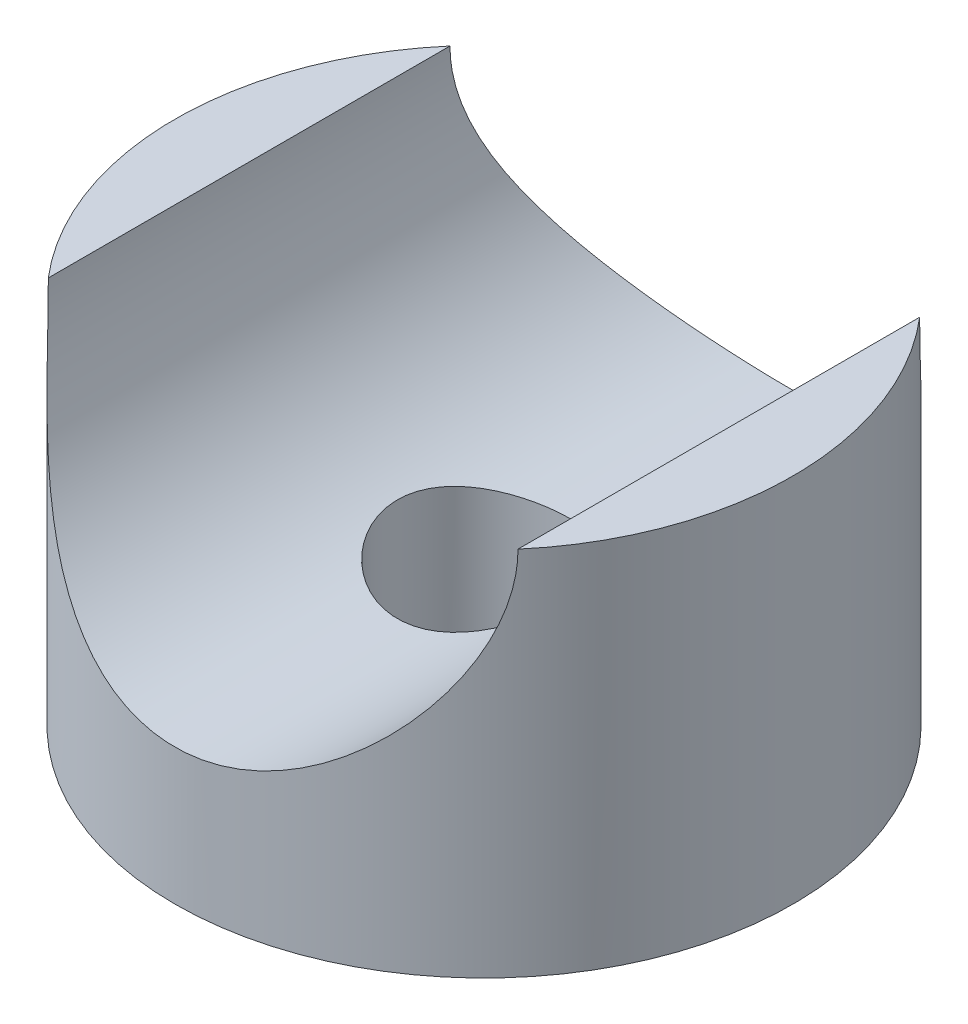
ISO-10303-21;
HEADER;
FILE_DESCRIPTION(('STEP AP214'),'2;1');
FILE_NAME('part.step','',(''),(''),'','','');
FILE_SCHEMA(('AUTOMOTIVE_DESIGN { 1 0 10303 214 1 1 1 1 }'));
ENDSEC;
DATA;
#1=APPLICATION_CONTEXT('core data for automotive mechanical design processes');
#2=APPLICATION_PROTOCOL_DEFINITION('international standard','automotive_design',2000,#1);
#3=PRODUCT_CONTEXT('',#1,'mechanical');
#4=PRODUCT('Part','Part','',(#3));
#5=PRODUCT_RELATED_PRODUCT_CATEGORY('part','',(#4));
#6=PRODUCT_DEFINITION_FORMATION('','',#4);
#7=PRODUCT_DEFINITION_CONTEXT('part definition',#1,'design');
#8=PRODUCT_DEFINITION('design','',#6,#7);
#9=PRODUCT_DEFINITION_SHAPE('','',#8);
#10=(LENGTH_UNIT() NAMED_UNIT(*) SI_UNIT(.MILLI.,.METRE.));
#11=(NAMED_UNIT(*) PLANE_ANGLE_UNIT() SI_UNIT($,.RADIAN.));
#12=(NAMED_UNIT(*) SI_UNIT($,.STERADIAN.) SOLID_ANGLE_UNIT());
#13=UNCERTAINTY_MEASURE_WITH_UNIT(LENGTH_MEASURE(1.E-05),#10,'distance_accuracy_value','');
#14=(GEOMETRIC_REPRESENTATION_CONTEXT(3) GLOBAL_UNCERTAINTY_ASSIGNED_CONTEXT((#13)) GLOBAL_UNIT_ASSIGNED_CONTEXT((#10,
#11,#12)) REPRESENTATION_CONTEXT('',''));
#15=CARTESIAN_POINT('',(0.,0.,0.));
#16=DIRECTION('',(0.,0.,1.));
#17=DIRECTION('',(1.,0.,0.));
#18=AXIS2_PLACEMENT_3D('',#15,#16,#17);
#19=CARTESIAN_POINT('',(0.,15.,0.));
#20=DIRECTION('',(0.,1.,0.));
#21=DIRECTION('',(0.,0.,1.));
#22=AXIS2_PLACEMENT_3D('',#19,#20,#21);
#23=PLANE('',#22);
#24=CARTESIAN_POINT('',(0.,15.,0.));
#25=DIRECTION('',(0.,1.,0.));
#26=DIRECTION('',(0.,0.,1.));
#27=AXIS2_PLACEMENT_3D('',#24,#25,#26);
#28=CIRCLE('',#27,12.5);
#29=CARTESIAN_POINT('',(9.5,15.,8.12403840463596));
#30=VERTEX_POINT('',#29);
#31=CARTESIAN_POINT('',(9.5,15.,-8.12403840463596));
#32=VERTEX_POINT('',#31);
#33=EDGE_CURVE('E13',#30,#32,#28,.T.);
#34=ORIENTED_EDGE('',*,*,#33,.T.);
#35=DIRECTION('',(0.,0.,-1.));
#36=VECTOR('',#35,1.);
#37=CARTESIAN_POINT('',(9.5,15.,22.));
#38=LINE('',#37,#36);
#39=EDGE_CURVE('E74',#32,#30,#38,.F.);
#40=ORIENTED_EDGE('',*,*,#39,.T.);
#41=EDGE_LOOP('',(#34,#40));
#42=FACE_BOUND('',#41,.T.);
#43=ADVANCED_FACE('F51',(#42),#23,.T.);
#44=CARTESIAN_POINT('',(-9.5,15.,-8.12403840463596));
#45=VERTEX_POINT('',#44);
#46=CARTESIAN_POINT('',(-9.5,15.,8.12403840463596));
#47=VERTEX_POINT('',#46);
#48=EDGE_CURVE('E66',#45,#47,#28,.T.);
#49=ORIENTED_EDGE('',*,*,#48,.T.);
#50=DIRECTION('',(0.,0.,-1.));
#51=VECTOR('',#50,1.);
#52=CARTESIAN_POINT('',(-9.5,15.,22.));
#53=LINE('',#52,#51);
#54=EDGE_CURVE('E88',#47,#45,#53,.T.);
#55=ORIENTED_EDGE('',*,*,#54,.T.);
#56=EDGE_LOOP('',(#49,#55));
#57=FACE_BOUND('',#56,.T.);
#58=ADVANCED_FACE('F91',(#57),#23,.T.);
#59=CARTESIAN_POINT('',(0.,15.,0.));
#60=DIRECTION('',(0.,-1.,0.));
#61=DIRECTION('',(0.,0.,-1.));
#62=AXIS2_PLACEMENT_3D('',#59,#60,#61);
#63=CYLINDRICAL_SURFACE('',#62,12.5);
#64=CARTESIAN_POINT('',(0.,0.,0.));
#65=DIRECTION('',(0.,1.,0.));
#66=DIRECTION('',(0.,0.,1.));
#67=AXIS2_PLACEMENT_3D('',#64,#65,#66);
#68=CIRCLE('',#67,12.5);
#69=CARTESIAN_POINT('',(0.,0.,12.5));
#70=VERTEX_POINT('',#69);
#71=EDGE_CURVE('E92',#70,#70,#68,.T.);
#72=ORIENTED_EDGE('',*,*,#71,.T.);
#73=EDGE_LOOP('',(#72));
#74=FACE_BOUND('',#73,.T.);
#75=CARTESIAN_POINT('',(-9.5,15.,8.12403840463596));
#76=CARTESIAN_POINT('',(-9.50000274311843,14.8886300570297,8.12402973250241));
#77=CARTESIAN_POINT('',(-9.49804091295763,14.7772826773266,8.12632986945214));
#78=CARTESIAN_POINT('',(-9.49022022968377,14.5549308435585,8.1354639676329));
#79=CARTESIAN_POINT('',(-9.48436208330054,14.4439263309706,8.14229710664883));
#80=CARTESIAN_POINT('',(-9.46103081893254,14.1123893025562,8.16942449957605));
#81=CARTESIAN_POINT('',(-9.43780050702786,13.8927507458728,8.19634761223029));
#82=CARTESIAN_POINT('',(-9.37705660977574,13.4612788235135,8.26576504344153));
#83=CARTESIAN_POINT('',(-9.33974781483549,13.2493792043068,8.30803579145839));
#84=CARTESIAN_POINT('',(-9.25165735130008,12.8314813522188,8.40601978871379));
#85=CARTESIAN_POINT('',(-9.20086720627091,12.6254869228445,8.46174149327323));
#86=CARTESIAN_POINT('',(-9.07445549509806,12.1769537353766,8.597358574814));
#87=CARTESIAN_POINT('',(-8.99584440118128,11.9360550148814,8.67987543983865));
#88=CARTESIAN_POINT('',(-8.8214755089005,11.4652245601162,8.85703167883857));
#89=CARTESIAN_POINT('',(-8.72571426508189,11.2352950413283,8.95167348761808));
#90=CARTESIAN_POINT('',(-8.51755951872615,10.7853872470806,9.14997035642966));
#91=CARTESIAN_POINT('',(-8.40507579029559,10.5654719802833,9.25367296784296));
#92=CARTESIAN_POINT('',(-8.16467650812218,10.1370386397966,9.46645814209731));
#93=CARTESIAN_POINT('',(-8.03676202295207,9.92851977836288,9.57554033209612));
#94=CARTESIAN_POINT('',(-7.7630514049336,9.51847476755879,9.79882186332866));
#95=CARTESIAN_POINT('',(-7.61692480871929,9.3172020347856,9.91308095888356));
#96=CARTESIAN_POINT('',(-7.30945957890885,8.92681867322858,10.1419196424029));
#97=CARTESIAN_POINT('',(-7.14812052829152,8.73770837809457,10.2564992390697));
#98=CARTESIAN_POINT('',(-6.81082794722964,8.37246005854712,10.4835045605759));
#99=CARTESIAN_POINT('',(-6.63490463772777,8.19629656871527,10.5959341732868));
#100=CARTESIAN_POINT('',(-6.26832404086982,7.85713791608482,10.8168351402387));
#101=CARTESIAN_POINT('',(-6.077661938515,7.6941470925226,10.9253051837498));
#102=CARTESIAN_POINT('',(-5.69018498924475,7.38881938250744,11.1318448048814));
#103=CARTESIAN_POINT('',(-5.49395649728446,7.24590521324126,11.2301593559457));
#104=CARTESIAN_POINT('',(-5.0887610607027,6.97416800901697,11.4194783697716));
#105=CARTESIAN_POINT('',(-4.87980041700756,6.84533809080246,11.5104863975489));
#106=CARTESIAN_POINT('',(-4.44955681155556,6.60283138463767,11.6835450269374));
#107=CARTESIAN_POINT('',(-4.22826853109066,6.48916121021278,11.7655917163059));
#108=CARTESIAN_POINT('',(-3.77434727376475,6.27836536661906,11.9189631724844));
#109=CARTESIAN_POINT('',(-3.5417143874596,6.18123956541616,11.9902880248606));
#110=CARTESIAN_POINT('',(-3.06417116692746,6.00409565362973,12.1211673632536));
#111=CARTESIAN_POINT('',(-2.81916731468968,5.92424375895675,12.1806071064541));
#112=CARTESIAN_POINT('',(-2.32063082407474,5.78416049074091,12.2853381050529));
#113=CARTESIAN_POINT('',(-2.06709806000297,5.72392940649909,12.3306291518337));
#114=CARTESIAN_POINT('',(-1.55398749176043,5.62432162677453,12.4057355673124));
#115=CARTESIAN_POINT('',(-1.2944165309343,5.58492241914602,12.4355676411837));
#116=CARTESIAN_POINT('',(-0.771571139065844,5.52773539196665,12.4789200108215));
#117=CARTESIAN_POINT('',(-0.508297391164107,5.50994363754252,12.4924432765366));
#118=CARTESIAN_POINT('',(-0.0214108900279489,5.49739891616266,12.5019767599162));
#119=CARTESIAN_POINT('',(0.202083514714958,5.49952743337226,12.500357561664));
#120=CARTESIAN_POINT('',(0.647961513731043,5.51949726368889,12.4851867280044));
#121=CARTESIAN_POINT('',(0.870345151876429,5.53733795119362,12.4716355676851));
#122=CARTESIAN_POINT('',(1.31228767264574,5.58844381441504,12.4329044595135));
#123=CARTESIAN_POINT('',(1.53184665915875,5.62170842117229,12.4077249406099));
#124=CARTESIAN_POINT('',(1.966598123833,5.70315077345239,12.3462824945646));
#125=CARTESIAN_POINT('',(2.18179048467794,5.75132891908723,12.3100192700612));
#126=CARTESIAN_POINT('',(2.59969741926879,5.86015778665746,12.2284692675171));
#127=CARTESIAN_POINT('',(2.80259129470676,5.92036472074974,12.1835049718898));
#128=CARTESIAN_POINT('',(3.20202564336949,6.05341616835359,12.0846753355438));
#129=CARTESIAN_POINT('',(3.39856405265207,6.12626473930742,12.0308071373052));
#130=CARTESIAN_POINT('',(3.78432828644699,6.28379331482866,11.9150914185243));
#131=CARTESIAN_POINT('',(3.97355617084335,6.36846995510475,11.8532461672997));
#132=CARTESIAN_POINT('',(4.34417810144068,6.54892788404103,11.7224891677027));
#133=CARTESIAN_POINT('',(4.52556931045861,6.64471314897653,11.6535748900345));
#134=CARTESIAN_POINT('',(4.90332033534794,6.85993110117712,11.5001866415938));
#135=CARTESIAN_POINT('',(5.0985058177922,6.9808167937332,11.4148587293952));
#136=CARTESIAN_POINT('',(5.47767750618184,7.23487624326171,11.2378308747473));
#137=CARTESIAN_POINT('',(5.66166204346254,7.36805182372579,11.1461299872186));
#138=CARTESIAN_POINT('',(6.01828549252876,7.6459938964851,10.9576892677936));
#139=CARTESIAN_POINT('',(6.19091173201522,7.79077294830337,10.8609440165777));
#140=CARTESIAN_POINT('',(6.52432917270586,8.09105972248036,10.6639868482345));
#141=CARTESIAN_POINT('',(6.6851234355656,8.24656464907917,10.5637758378469));
#142=CARTESIAN_POINT('',(7.02641580338636,8.60064956837671,10.3406522330836));
#143=CARTESIAN_POINT('',(7.20422768780279,8.80153907572682,10.2172845222993));
#144=CARTESIAN_POINT('',(7.54225611222099,9.21759219343414,9.97036555253643));
#145=CARTESIAN_POINT('',(7.70246828671849,9.43275932413731,9.84681425568827));
#146=CARTESIAN_POINT('',(8.00486771787172,9.87707717618402,9.60259693431027));
#147=CARTESIAN_POINT('',(8.14704981082693,10.1062318757683,9.48193174433506));
#148=CARTESIAN_POINT('',(8.41261148515566,10.578317636569,9.24712636887976));
#149=CARTESIAN_POINT('',(8.53599831156128,10.8212433396611,9.13298367982003));
#150=CARTESIAN_POINT('',(8.72997805545987,11.24828310395,8.94706383877389));
#151=CARTESIAN_POINT('',(8.80549970448397,11.4290020857464,8.87260600909018));
#152=CARTESIAN_POINT('',(8.9460438862266,11.7973209108525,8.73087944558635));
#153=CARTESIAN_POINT('',(9.01106375219991,11.984922487083,8.66361253923792));
#154=CARTESIAN_POINT('',(9.12968068925038,12.3658836086356,8.53852079275913));
#155=CARTESIAN_POINT('',(9.18332289168828,12.5592168000997,8.4806588682495));
#156=CARTESIAN_POINT('',(9.27874395633497,12.9516755198605,8.37615244635763));
#157=CARTESIAN_POINT('',(9.32053098025425,13.1507969586049,8.32950023503934));
#158=CARTESIAN_POINT('',(9.37959259341158,13.4861556792478,8.26283855707346));
#159=CARTESIAN_POINT('',(9.40038638235435,13.6210541567335,8.23914317195109));
#160=CARTESIAN_POINT('',(9.43622229720901,13.8925481566748,8.19807598062425));
#161=CARTESIAN_POINT('',(9.45126582023549,14.0291432585715,8.18070263843258));
#162=CARTESIAN_POINT('',(9.47551371966966,14.3044183883412,8.15260739127683));
#163=CARTESIAN_POINT('',(9.4846804510259,14.4431061453022,8.14192837775227));
#164=CARTESIAN_POINT('',(9.49693172911945,14.7211910819632,8.12762597874081));
#165=CARTESIAN_POINT('',(9.50001275466359,14.860588625613,8.12400667802326));
#166=CARTESIAN_POINT('',(9.5,15.,8.12403840463596));
#167=B_SPLINE_CURVE_WITH_KNOTS('',3,(#75,#76,#77,#78,#79,#80,#81,#82,#83,#84,#85,#86,#87,#88,
#89,#90,#91,#92,#93,#94,#95,#96,#97,#98,#99,#100,#101,#102,#103,#104,#105,#106,#107,#108,#109,
#110,#111,#112,#113,#114,#115,#116,#117,#118,#119,#120,#121,#122,#123,#124,#125,#126,#127,#128,
#129,#130,#131,#132,#133,#134,#135,#136,#137,#138,#139,#140,#141,#142,#143,#144,#145,#146,#147,
#148,#149,#150,#151,#152,#153,#154,#155,#156,#157,#158,#159,#160,#161,#162,#163,#164,#165,#166),
.UNSPECIFIED.,.F.,.F.,(4,2,2,2,2,2,2,2,2,2,2,2,2,2,2,2,2,2,2,2,2,2,2,2,2,2,2,2,2,2,2,2,2,2,2,2,
2,2,2,2,2,2,2,2,2,4),(0.,0.334025338390052,0.667990106409527,1.33418107436726,1.99103326031616,
2.64829942613267,3.44656111619992,4.24498335681716,5.04788129399272,5.85072366274221,
6.67116164265407,7.49162211989217,8.31042304390908,9.12949260075239,9.91447217839496,
10.6990663893952,11.4840017722281,12.2689308905102,13.0611064617795,13.8532937128335,
14.6446231211512,15.4358084010501,16.1054893117806,16.7751435594229,17.444773106742,
18.1144206209592,18.7628405919965,19.4114690652367,20.0599134214917,20.7085906056592,
21.442688459012,22.1768954085738,22.9119080793108,23.6467298836072,24.5316822644503,
25.4168536592194,26.3022779916381,27.1873601501427,27.8155486395689,28.4438963965994,
29.0697030628903,29.6950778405795,30.1104337238951,30.5256886259363,30.9435776336551,
31.361708361469),.UNSPECIFIED.);
#168=EDGE_CURVE('E80',#47,#30,#167,.T.);
#169=ORIENTED_EDGE('',*,*,#168,.F.);
#170=ORIENTED_EDGE('',*,*,#48,.F.);
#171=CARTESIAN_POINT('',(9.5,15.,-8.12403840463596));
#172=CARTESIAN_POINT('',(9.50000274311843,14.8886300570297,-8.12402973250241));
#173=CARTESIAN_POINT('',(9.49804091295763,14.7772826773266,-8.12632986945214));
#174=CARTESIAN_POINT('',(9.49022022968377,14.5549308435585,-8.1354639676329));
#175=CARTESIAN_POINT('',(9.48436208330054,14.4439263309706,-8.14229710664883));
#176=CARTESIAN_POINT('',(9.46103081893254,14.1123893025562,-8.16942449957605));
#177=CARTESIAN_POINT('',(9.43780050702786,13.8927507458728,-8.19634761223029));
#178=CARTESIAN_POINT('',(9.37705660977574,13.4612788235135,-8.26576504344153));
#179=CARTESIAN_POINT('',(9.33974781483549,13.2493792043068,-8.30803579145839));
#180=CARTESIAN_POINT('',(9.25165735130008,12.8314813522188,-8.40601978871379));
#181=CARTESIAN_POINT('',(9.20086720627091,12.6254869228445,-8.46174149327323));
#182=CARTESIAN_POINT('',(9.07445549509806,12.1769537353766,-8.597358574814));
#183=CARTESIAN_POINT('',(8.99584440118128,11.9360550148814,-8.67987543983865));
#184=CARTESIAN_POINT('',(8.8214755089005,11.4652245601162,-8.85703167883857));
#185=CARTESIAN_POINT('',(8.72571426508189,11.2352950413283,-8.95167348761808));
#186=CARTESIAN_POINT('',(8.51755951872615,10.7853872470806,-9.14997035642966));
#187=CARTESIAN_POINT('',(8.40507579029559,10.5654719802833,-9.25367296784296));
#188=CARTESIAN_POINT('',(8.16467650812218,10.1370386397966,-9.46645814209731));
#189=CARTESIAN_POINT('',(8.03676202295207,9.92851977836288,-9.57554033209612));
#190=CARTESIAN_POINT('',(7.7630514049336,9.51847476755879,-9.79882186332866));
#191=CARTESIAN_POINT('',(7.61692480871929,9.3172020347856,-9.91308095888356));
#192=CARTESIAN_POINT('',(7.30945957890885,8.92681867322858,-10.1419196424029));
#193=CARTESIAN_POINT('',(7.14812052829152,8.73770837809457,-10.2564992390697));
#194=CARTESIAN_POINT('',(6.81082794722964,8.37246005854712,-10.4835045605759));
#195=CARTESIAN_POINT('',(6.63490463772777,8.19629656871527,-10.5959341732868));
#196=CARTESIAN_POINT('',(6.26832404086982,7.85713791608482,-10.8168351402387));
#197=CARTESIAN_POINT('',(6.077661938515,7.6941470925226,-10.9253051837498));
#198=CARTESIAN_POINT('',(5.69018498924475,7.38881938250744,-11.1318448048814));
#199=CARTESIAN_POINT('',(5.49395649728446,7.24590521324126,-11.2301593559457));
#200=CARTESIAN_POINT('',(5.0887610607027,6.97416800901697,-11.4194783697716));
#201=CARTESIAN_POINT('',(4.87980041700756,6.84533809080246,-11.5104863975489));
#202=CARTESIAN_POINT('',(4.44955681155556,6.60283138463767,-11.6835450269374));
#203=CARTESIAN_POINT('',(4.22826853109066,6.48916121021278,-11.7655917163059));
#204=CARTESIAN_POINT('',(3.77434727376475,6.27836536661906,-11.9189631724844));
#205=CARTESIAN_POINT('',(3.5417143874596,6.18123956541616,-11.9902880248606));
#206=CARTESIAN_POINT('',(3.06417116692746,6.00409565362973,-12.1211673632536));
#207=CARTESIAN_POINT('',(2.81916731468968,5.92424375895675,-12.1806071064541));
#208=CARTESIAN_POINT('',(2.32063082407474,5.78416049074091,-12.2853381050529));
#209=CARTESIAN_POINT('',(2.06709806000297,5.72392940649909,-12.3306291518337));
#210=CARTESIAN_POINT('',(1.55398749176043,5.62432162677453,-12.4057355673124));
#211=CARTESIAN_POINT('',(1.2944165309343,5.58492241914602,-12.4355676411837));
#212=CARTESIAN_POINT('',(0.771571139065844,5.52773539196665,-12.4789200108215));
#213=CARTESIAN_POINT('',(0.508297391164107,5.50994363754252,-12.4924432765366));
#214=CARTESIAN_POINT('',(0.0214108900279489,5.49739891616266,-12.5019767599162));
#215=CARTESIAN_POINT('',(-0.202083514714958,5.49952743337226,-12.500357561664));
#216=CARTESIAN_POINT('',(-0.647961513731043,5.51949726368889,-12.4851867280044));
#217=CARTESIAN_POINT('',(-0.870345151876429,5.53733795119362,-12.4716355676851));
#218=CARTESIAN_POINT('',(-1.31228767264574,5.58844381441504,-12.4329044595135));
#219=CARTESIAN_POINT('',(-1.53184665915875,5.62170842117229,-12.4077249406099));
#220=CARTESIAN_POINT('',(-1.966598123833,5.70315077345239,-12.3462824945646));
#221=CARTESIAN_POINT('',(-2.18179048467794,5.75132891908723,-12.3100192700612));
#222=CARTESIAN_POINT('',(-2.59969741926879,5.86015778665746,-12.2284692675171));
#223=CARTESIAN_POINT('',(-2.80259129470676,5.92036472074974,-12.1835049718898));
#224=CARTESIAN_POINT('',(-3.20202564336949,6.05341616835359,-12.0846753355438));
#225=CARTESIAN_POINT('',(-3.39856405265207,6.12626473930742,-12.0308071373052));
#226=CARTESIAN_POINT('',(-3.78432828644699,6.28379331482866,-11.9150914185243));
#227=CARTESIAN_POINT('',(-3.97355617084335,6.36846995510475,-11.8532461672997));
#228=CARTESIAN_POINT('',(-4.34417810144068,6.54892788404103,-11.7224891677027));
#229=CARTESIAN_POINT('',(-4.52556931045861,6.64471314897653,-11.6535748900345));
#230=CARTESIAN_POINT('',(-4.90332033534794,6.85993110117712,-11.5001866415938));
#231=CARTESIAN_POINT('',(-5.0985058177922,6.9808167937332,-11.4148587293952));
#232=CARTESIAN_POINT('',(-5.47767750618184,7.23487624326171,-11.2378308747473));
#233=CARTESIAN_POINT('',(-5.66166204346254,7.36805182372579,-11.1461299872186));
#234=CARTESIAN_POINT('',(-6.01828549252876,7.6459938964851,-10.9576892677936));
#235=CARTESIAN_POINT('',(-6.19091173201522,7.79077294830337,-10.8609440165777));
#236=CARTESIAN_POINT('',(-6.52432917270586,8.09105972248036,-10.6639868482345));
#237=CARTESIAN_POINT('',(-6.6851234355656,8.24656464907917,-10.5637758378469));
#238=CARTESIAN_POINT('',(-7.02641580338636,8.60064956837671,-10.3406522330836));
#239=CARTESIAN_POINT('',(-7.20422768780279,8.80153907572682,-10.2172845222993));
#240=CARTESIAN_POINT('',(-7.54225611222099,9.21759219343414,-9.97036555253643));
#241=CARTESIAN_POINT('',(-7.70246828671849,9.43275932413731,-9.84681425568827));
#242=CARTESIAN_POINT('',(-8.00486771787172,9.87707717618402,-9.60259693431027));
#243=CARTESIAN_POINT('',(-8.14704981082693,10.1062318757683,-9.48193174433506));
#244=CARTESIAN_POINT('',(-8.41261148515566,10.578317636569,-9.24712636887976));
#245=CARTESIAN_POINT('',(-8.53599831156128,10.8212433396611,-9.13298367982003));
#246=CARTESIAN_POINT('',(-8.72997805545987,11.24828310395,-8.94706383877389));
#247=CARTESIAN_POINT('',(-8.80549970448397,11.4290020857464,-8.87260600909018));
#248=CARTESIAN_POINT('',(-8.9460438862266,11.7973209108525,-8.73087944558635));
#249=CARTESIAN_POINT('',(-9.01106375219991,11.984922487083,-8.66361253923792));
#250=CARTESIAN_POINT('',(-9.12968068925038,12.3658836086356,-8.53852079275913));
#251=CARTESIAN_POINT('',(-9.18332289168828,12.5592168000997,-8.4806588682495));
#252=CARTESIAN_POINT('',(-9.27874395633497,12.9516755198605,-8.37615244635763));
#253=CARTESIAN_POINT('',(-9.32053098025425,13.1507969586049,-8.32950023503934));
#254=CARTESIAN_POINT('',(-9.37959259341158,13.4861556792478,-8.26283855707346));
#255=CARTESIAN_POINT('',(-9.40038638235435,13.6210541567335,-8.23914317195109));
#256=CARTESIAN_POINT('',(-9.43622229720901,13.8925481566748,-8.19807598062425));
#257=CARTESIAN_POINT('',(-9.45126582023549,14.0291432585715,-8.18070263843258));
#258=CARTESIAN_POINT('',(-9.47551371966966,14.3044183883412,-8.15260739127683));
#259=CARTESIAN_POINT('',(-9.4846804510259,14.4431061453022,-8.14192837775227));
#260=CARTESIAN_POINT('',(-9.49693172911945,14.7211910819632,-8.12762597874081));
#261=CARTESIAN_POINT('',(-9.50001275466359,14.860588625613,-8.12400667802326));
#262=CARTESIAN_POINT('',(-9.5,15.,-8.12403840463596));
#263=B_SPLINE_CURVE_WITH_KNOTS('',3,(#171,#172,#173,#174,#175,#176,#177,#178,#179,#180,#181,
#182,#183,#184,#185,#186,#187,#188,#189,#190,#191,#192,#193,#194,#195,#196,#197,#198,#199,#200,
#201,#202,#203,#204,#205,#206,#207,#208,#209,#210,#211,#212,#213,#214,#215,#216,#217,#218,#219,
#220,#221,#222,#223,#224,#225,#226,#227,#228,#229,#230,#231,#232,#233,#234,#235,#236,#237,#238,
#239,#240,#241,#242,#243,#244,#245,#246,#247,#248,#249,#250,#251,#252,#253,#254,#255,#256,#257,
#258,#259,#260,#261,#262),.UNSPECIFIED.,.F.,.F.,(4,2,2,2,2,2,2,2,2,2,2,2,2,2,2,2,2,2,2,2,2,2,2,
2,2,2,2,2,2,2,2,2,2,2,2,2,2,2,2,2,2,2,2,2,2,4),(0.,0.334025338390052,0.667990106409527,
1.33418107436726,1.99103326031616,2.64829942613267,3.44656111619992,4.24498335681716,
5.04788129399272,5.85072366274221,6.67116164265407,7.49162211989217,8.31042304390908,
9.12949260075239,9.91447217839496,10.6990663893952,11.4840017722281,12.2689308905102,
13.0611064617795,13.8532937128335,14.6446231211512,15.4358084010501,16.1054893117806,
16.7751435594229,17.444773106742,18.1144206209592,18.7628405919965,19.4114690652367,
20.0599134214917,20.7085906056592,21.442688459012,22.1768954085738,22.9119080793108,
23.6467298836072,24.5316822644503,25.4168536592194,26.3022779916381,27.1873601501427,
27.8155486395689,28.4438963965994,29.0697030628903,29.6950778405795,30.1104337238951,
30.5256886259363,30.9435776336551,31.361708361469),.UNSPECIFIED.);
#264=EDGE_CURVE('E82',#32,#45,#263,.T.);
#265=ORIENTED_EDGE('',*,*,#264,.F.);
#266=ORIENTED_EDGE('',*,*,#33,.F.);
#267=EDGE_LOOP('',(#169,#170,#265,#266));
#268=FACE_BOUND('',#267,.T.);
#269=ADVANCED_FACE('F52',(#74,#268),#63,.T.);
#270=CARTESIAN_POINT('',(0.,15.,0.));
#271=DIRECTION('',(0.,-1.,0.));
#272=DIRECTION('',(0.,0.,-1.));
#273=AXIS2_PLACEMENT_3D('',#270,#271,#272);
#274=CYLINDRICAL_SURFACE('',#273,3.5);
#275=CARTESIAN_POINT('',(0.,0.,0.));
#276=DIRECTION('',(0.,1.,0.));
#277=DIRECTION('',(0.,0.,1.));
#278=AXIS2_PLACEMENT_3D('',#275,#276,#277);
#279=CIRCLE('',#278,3.5);
#280=CARTESIAN_POINT('',(0.,0.,3.5));
#281=VERTEX_POINT('',#280);
#282=EDGE_CURVE('E100',#281,#281,#279,.T.);
#283=ORIENTED_EDGE('',*,*,#282,.F.);
#284=EDGE_LOOP('',(#283));
#285=FACE_BOUND('',#284,.T.);
#286=CARTESIAN_POINT('',(0.,5.5,-3.5));
#287=CARTESIAN_POINT('',(-0.189782501016907,5.4999958038041,-3.50000567673176));
#288=CARTESIAN_POINT('',(-0.379525465519282,5.5057369492587,-3.48451535043739));
#289=CARTESIAN_POINT('',(-0.753353777934343,5.52806721122014,-3.42320385504151));
#290=CARTESIAN_POINT('',(-0.937439719035304,5.54465518625043,-3.37738587749335));
#291=CARTESIAN_POINT('',(-1.2945095547621,5.5868948935147,-3.25725069775693));
#292=CARTESIAN_POINT('',(-1.46751368933484,5.61252951083329,-3.18298728764704));
#293=CARTESIAN_POINT('',(-1.79859902900946,5.67029902190438,-3.00833791156295));
#294=CARTESIAN_POINT('',(-1.95667636914745,5.70243559246178,-2.90794520512273));
#295=CARTESIAN_POINT('',(-2.25993516417948,5.77136078262481,-2.67956186020878));
#296=CARTESIAN_POINT('',(-2.40441940867956,5.80827786997151,-2.55068454371694));
#297=CARTESIAN_POINT('',(-2.67028099144139,5.88195927322811,-2.27087286625019));
#298=CARTESIAN_POINT('',(-2.79165160973059,5.91872354167837,-2.11993211310768));
#299=CARTESIAN_POINT('',(-3.01219773781402,5.98941772726426,-1.79355498441448));
#300=CARTESIAN_POINT('',(-3.11040143419667,6.02319521210075,-1.61742561122388));
#301=CARTESIAN_POINT('',(-3.27548448295336,6.08209995500976,-1.24970903558207));
#302=CARTESIAN_POINT('',(-3.34237585199901,6.10723053050739,-1.05812779620812));
#303=CARTESIAN_POINT('',(-3.44020525284718,6.14462602515818,-0.672958404983974));
#304=CARTESIAN_POINT('',(-3.47247028118448,6.15736390344071,-0.479754735360218));
#305=CARTESIAN_POINT('',(-3.50428049821036,6.16991846346853,-0.0902878842327004));
#306=CARTESIAN_POINT('',(-3.50383860343316,6.1697402460058,0.10597405889124));
#307=CARTESIAN_POINT('',(-3.47126475055506,6.15689166205385,0.483988015129881));
#308=CARTESIAN_POINT('',(-3.44095464788778,6.14493948000296,0.665925910631393));
#309=CARTESIAN_POINT('',(-3.35251002768895,6.11108019722783,1.02192411374398));
#310=CARTESIAN_POINT('',(-3.29437146759006,6.08917165019186,1.19598327280928));
#311=CARTESIAN_POINT('',(-3.15088915412677,6.03742307342386,1.53506549926057));
#312=CARTESIAN_POINT('',(-3.06506205338442,6.00744382389356,1.69986185856708));
#313=CARTESIAN_POINT('',(-2.86897555392001,5.94298006857855,2.01324973298194));
#314=CARTESIAN_POINT('',(-2.75870793008588,5.908494047711,2.16183576755551));
#315=CARTESIAN_POINT('',(-2.50846742755721,5.83617999007089,2.44869615783488));
#316=CARTESIAN_POINT('',(-2.36703436130135,5.79828007541075,2.5856816446701));
#317=CARTESIAN_POINT('',(-2.06276098627608,5.72533193421493,2.83436569639828));
#318=CARTESIAN_POINT('',(-1.89991761761246,5.69028411645342,2.94606064062215));
#319=CARTESIAN_POINT('',(-1.55425080945075,5.62633488479242,3.14234867474262));
#320=CARTESIAN_POINT('',(-1.37117248249021,5.59752968773417,3.22652646805256));
#321=CARTESIAN_POINT('',(-0.992129236289006,5.55002206113434,3.36246473105117));
#322=CARTESIAN_POINT('',(-0.796169873072212,5.53131530745671,3.41423907735591));
#323=CARTESIAN_POINT('',(-0.407785098049792,5.50686523820606,3.48145525966205));
#324=CARTESIAN_POINT('',(-0.215698885603694,5.50050295084687,3.49863362516764));
#325=CARTESIAN_POINT('',(0.168693825123766,5.49955519304176,3.50120855391341));
#326=CARTESIAN_POINT('',(0.361000267879162,5.50496721869781,3.48661187436037));
#327=CARTESIAN_POINT('',(0.73296228202721,5.52655126493634,3.42738074782359));
#328=CARTESIAN_POINT('',(0.91282295003389,5.5423197931353,3.38387200287894));
#329=CARTESIAN_POINT('',(1.26257444353581,5.58262666547364,3.2695215811399));
#330=CARTESIAN_POINT('',(1.43246396841083,5.60716615073619,3.19867634770539));
#331=CARTESIAN_POINT('',(1.76296255146319,5.66346457101361,3.02942753106686));
#332=CARTESIAN_POINT('',(1.92316001481877,5.69541210637174,2.93028484627077));
#333=CARTESIAN_POINT('',(2.22517268023633,5.76297696360322,2.70809576071882));
#334=CARTESIAN_POINT('',(2.36698123687887,5.79859560384799,2.58504075839893));
#335=CARTESIAN_POINT('',(2.63648468203052,5.87204574870559,2.31040992394645));
#336=CARTESIAN_POINT('',(2.76294570230384,5.90988954521082,2.15762342009612));
#337=CARTESIAN_POINT('',(2.98866258261646,5.98157649579237,1.83223900063951));
#338=CARTESIAN_POINT('',(3.08791644158605,6.01541935549824,1.65963962913306));
#339=CARTESIAN_POINT('',(3.25638938753798,6.07509198958079,1.29836371061516));
#340=CARTESIAN_POINT('',(3.32551955782824,6.10089797825666,1.10964150836264));
#341=CARTESIAN_POINT('',(3.43058856017998,6.14086441145671,0.72202526216965));
#342=CARTESIAN_POINT('',(3.46654695895906,6.15503172063753,0.523137287787688));
#343=CARTESIAN_POINT('',(3.50253657862739,6.16922564103435,0.134152212577613));
#344=CARTESIAN_POINT('',(3.50466237207741,6.17007660670431,-0.055722711907593));
#345=CARTESIAN_POINT('',(3.47825811563849,6.15964265237552,-0.432970917808789));
#346=CARTESIAN_POINT('',(3.44973076846231,6.14835880231345,-0.620344418302757));
#347=CARTESIAN_POINT('',(3.36443857794893,6.11560160287178,-0.981880038512177));
#348=CARTESIAN_POINT('',(3.30849937731209,6.09442698622296,-1.15626629262454));
#349=CARTESIAN_POINT('',(3.17068791273808,6.04443833361588,-1.49328689056117));
#350=CARTESIAN_POINT('',(3.08880920463654,6.01562239961167,-1.65591830178059));
#351=CARTESIAN_POINT('',(2.89658496161966,5.95176605961912,-1.97383959417803));
#352=CARTESIAN_POINT('',(2.78499900351247,5.91648289759912,-2.12833016993967));
#353=CARTESIAN_POINT('',(2.53847630436953,5.84453109342078,-2.41706427492377));
#354=CARTESIAN_POINT('',(2.40353227497615,5.80786202162048,-2.55130145999159));
#355=CARTESIAN_POINT('',(2.1058118573601,5.73500196073505,-2.80275390939182));
#356=CARTESIAN_POINT('',(1.94196010841773,5.69893281778088,-2.91873673662691));
#357=CARTESIAN_POINT('',(1.59583241829019,5.63334037800385,-3.12146392543305));
#358=CARTESIAN_POINT('',(1.41355612176271,5.60381720746401,-3.20820772294997));
#359=CARTESIAN_POINT('',(1.03012401507585,5.55398404820462,-3.35140042183531));
#360=CARTESIAN_POINT('',(0.828576938649612,5.53396223063076,-3.40691023718715));
#361=CARTESIAN_POINT('',(0.418001617055457,5.50697550378114,-3.48119849791931));
#362=CARTESIAN_POINT('',(0.208976839392466,5.50000462059332,-3.49999374913147));
#363=CARTESIAN_POINT('',(0.,5.5,-3.5));
#364=B_SPLINE_CURVE_WITH_KNOTS('',3,(#286,#287,#288,#289,#290,#291,#292,#293,#294,#295,#296,
#297,#298,#299,#300,#301,#302,#303,#304,#305,#306,#307,#308,#309,#310,#311,#312,#313,#314,#315,
#316,#317,#318,#319,#320,#321,#322,#323,#324,#325,#326,#327,#328,#329,#330,#331,#332,#333,#334,
#335,#336,#337,#338,#339,#340,#341,#342,#343,#344,#345,#346,#347,#348,#349,#350,#351,#352,#353,
#354,#355,#356,#357,#358,#359,#360,#361,#362,#363),.UNSPECIFIED.,.T.,.F.,(4,2,2,2,2,2,2,2,2,2,2,
2,2,2,2,2,2,2,2,2,2,2,2,2,2,2,2,2,2,2,2,2,2,2,2,2,2,2,4),(0.,0.56857697028979,1.13709411546253,
1.70454142530672,2.27213526251212,2.86081433921137,3.44966430592823,4.06000721954733,
4.67011571062265,5.2559017937606,5.84145654099497,6.39337480556043,6.94537327019459,
7.50758258773469,8.06998139691606,8.66876186325863,9.26762799866449,9.87515471171535,
10.4824210761106,11.0583598586182,11.634176175296,12.1887923687307,12.7434807453824,
13.3142430286781,13.8852110037383,14.4881301716657,15.09109367203,15.6958250907704,
16.3001995738259,16.8670008054195,17.4337520657802,17.984394516221,18.535173870446,
19.1140862902652,19.6931796733056,20.3020921905906,20.9110164538181,21.5373852917727,
22.1634673465767),.UNSPECIFIED.);
#365=CARTESIAN_POINT('',(0.,5.5,-3.5));
#366=VERTEX_POINT('',#365);
#367=EDGE_CURVE('E57',#366,#366,#364,.T.);
#368=ORIENTED_EDGE('',*,*,#367,.T.);
#369=EDGE_LOOP('',(#368));
#370=FACE_BOUND('',#369,.T.);
#371=ADVANCED_FACE('F109',(#285,#370),#274,.F.);
#372=CARTESIAN_POINT('',(0.,0.,0.));
#373=DIRECTION('',(0.,1.,0.));
#374=DIRECTION('',(0.,0.,1.));
#375=AXIS2_PLACEMENT_3D('',#372,#373,#374);
#376=PLANE('',#375);
#377=ORIENTED_EDGE('',*,*,#71,.F.);
#378=EDGE_LOOP('',(#377));
#379=FACE_BOUND('',#378,.T.);
#380=ORIENTED_EDGE('',*,*,#282,.T.);
#381=EDGE_LOOP('',(#380));
#382=FACE_BOUND('',#381,.T.);
#383=ADVANCED_FACE('F107',(#379,#382),#376,.F.);
#384=CARTESIAN_POINT('',(0.,15.,22.));
#385=DIRECTION('',(0.,0.,-1.));
#386=DIRECTION('',(-1.,0.,0.));
#387=AXIS2_PLACEMENT_3D('',#384,#385,#386);
#388=CYLINDRICAL_SURFACE('',#387,9.5);
#389=ORIENTED_EDGE('',*,*,#367,.F.);
#390=EDGE_LOOP('',(#389));
#391=FACE_BOUND('',#390,.T.);
#392=ORIENTED_EDGE('',*,*,#168,.T.);
#393=ORIENTED_EDGE('',*,*,#39,.F.);
#394=ORIENTED_EDGE('',*,*,#264,.T.);
#395=ORIENTED_EDGE('',*,*,#54,.F.);
#396=EDGE_LOOP('',(#392,#393,#394,#395));
#397=FACE_BOUND('',#396,.T.);
#398=ADVANCED_FACE('F84',(#391,#397),#388,.F.);
#399=CLOSED_SHELL('',(#43,#58,#269,#371,#383,#398));
#400=MANIFOLD_SOLID_BREP('B2',#399);
#401=ADVANCED_BREP_SHAPE_REPRESENTATION('',(#18,#400),#14);
#402=SHAPE_DEFINITION_REPRESENTATION(#9,#401);
ENDSEC;
END-ISO-10303-21;
